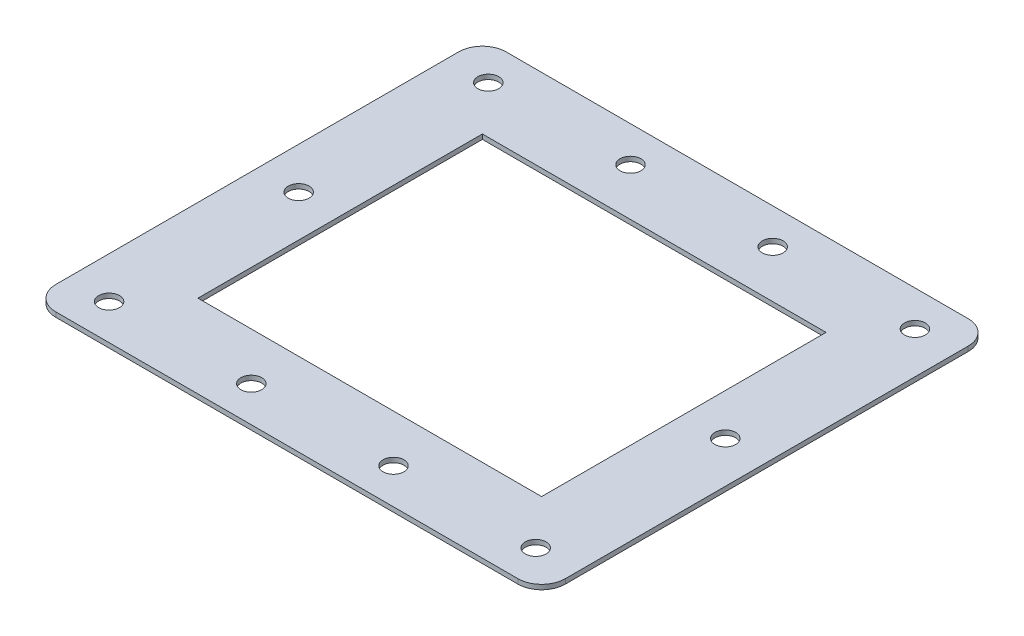
ISO-10303-21;
HEADER;
FILE_DESCRIPTION(('STEP AP214'),'2;1');
FILE_NAME('part.step','',(''),(''),'','','');
FILE_SCHEMA(('AUTOMOTIVE_DESIGN { 1 0 10303 214 1 1 1 1 }'));
ENDSEC;
DATA;
#1=APPLICATION_CONTEXT('core data for automotive mechanical design processes');
#2=APPLICATION_PROTOCOL_DEFINITION('international standard','automotive_design',2000,#1);
#3=PRODUCT_CONTEXT('',#1,'mechanical');
#4=PRODUCT('Part','Part','',(#3));
#5=PRODUCT_RELATED_PRODUCT_CATEGORY('part','',(#4));
#6=PRODUCT_DEFINITION_FORMATION('','',#4);
#7=PRODUCT_DEFINITION_CONTEXT('part definition',#1,'design');
#8=PRODUCT_DEFINITION('design','',#6,#7);
#9=PRODUCT_DEFINITION_SHAPE('','',#8);
#10=(LENGTH_UNIT() NAMED_UNIT(*) SI_UNIT(.MILLI.,.METRE.));
#11=(NAMED_UNIT(*) PLANE_ANGLE_UNIT() SI_UNIT($,.RADIAN.));
#12=(NAMED_UNIT(*) SI_UNIT($,.STERADIAN.) SOLID_ANGLE_UNIT());
#13=UNCERTAINTY_MEASURE_WITH_UNIT(LENGTH_MEASURE(1.E-05),#10,'distance_accuracy_value','');
#14=(GEOMETRIC_REPRESENTATION_CONTEXT(3) GLOBAL_UNCERTAINTY_ASSIGNED_CONTEXT((#13)) GLOBAL_UNIT_ASSIGNED_CONTEXT((#10,
#11,#12)) REPRESENTATION_CONTEXT('',''));
#15=CARTESIAN_POINT('',(0.,0.,0.));
#16=DIRECTION('',(0.,0.,1.));
#17=DIRECTION('',(1.,0.,0.));
#18=AXIS2_PLACEMENT_3D('',#15,#16,#17);
#19=CARTESIAN_POINT('',(0.,2.,0.));
#20=DIRECTION('',(0.,-1.,0.));
#21=DIRECTION('',(0.,0.,-1.));
#22=AXIS2_PLACEMENT_3D('',#19,#20,#21);
#23=PLANE('',#22);
#24=DIRECTION('',(-1.,0.,0.));
#25=VECTOR('',#24,1.);
#26=CARTESIAN_POINT('',(-107.5,2.,-95.));
#27=LINE('',#26,#25);
#28=CARTESIAN_POINT('',(97.5,2.,-95.));
#29=VERTEX_POINT('',#28);
#30=CARTESIAN_POINT('',(-97.5,2.,-95.));
#31=VERTEX_POINT('',#30);
#32=EDGE_CURVE('E173',#29,#31,#27,.T.);
#33=ORIENTED_EDGE('',*,*,#32,.T.);
#34=CARTESIAN_POINT('',(-97.5,2.,-85.));
#35=DIRECTION('',(0.,-1.,0.));
#36=DIRECTION('',(0.,0.,-1.));
#37=AXIS2_PLACEMENT_3D('',#34,#35,#36);
#38=CIRCLE('',#37,10.);
#39=CARTESIAN_POINT('',(-107.5,2.,-85.));
#40=VERTEX_POINT('',#39);
#41=EDGE_CURVE('E216',#31,#40,#38,.F.);
#42=ORIENTED_EDGE('',*,*,#41,.T.);
#43=DIRECTION('',(0.,0.,1.));
#44=VECTOR('',#43,1.);
#45=CARTESIAN_POINT('',(-107.5,2.,-95.));
#46=LINE('',#45,#44);
#47=CARTESIAN_POINT('',(-107.5,2.,85.));
#48=VERTEX_POINT('',#47);
#49=EDGE_CURVE('E176',#40,#48,#46,.T.);
#50=ORIENTED_EDGE('',*,*,#49,.T.);
#51=CARTESIAN_POINT('',(-97.5,2.,85.));
#52=DIRECTION('',(0.,-1.,0.));
#53=DIRECTION('',(0.,0.,-1.));
#54=AXIS2_PLACEMENT_3D('',#51,#52,#53);
#55=CIRCLE('',#54,10.);
#56=CARTESIAN_POINT('',(-97.5,2.,95.));
#57=VERTEX_POINT('',#56);
#58=EDGE_CURVE('E212',#48,#57,#55,.F.);
#59=ORIENTED_EDGE('',*,*,#58,.T.);
#60=DIRECTION('',(1.,0.,0.));
#61=VECTOR('',#60,1.);
#62=CARTESIAN_POINT('',(-107.5,2.,95.));
#63=LINE('',#62,#61);
#64=CARTESIAN_POINT('',(97.5,2.,95.));
#65=VERTEX_POINT('',#64);
#66=EDGE_CURVE('E180',#57,#65,#63,.T.);
#67=ORIENTED_EDGE('',*,*,#66,.T.);
#68=CARTESIAN_POINT('',(97.5,2.,85.));
#69=DIRECTION('',(0.,-1.,0.));
#70=DIRECTION('',(0.,0.,-1.));
#71=AXIS2_PLACEMENT_3D('',#68,#69,#70);
#72=CIRCLE('',#71,10.);
#73=CARTESIAN_POINT('',(107.5,2.,85.));
#74=VERTEX_POINT('',#73);
#75=EDGE_CURVE('E59',#65,#74,#72,.F.);
#76=ORIENTED_EDGE('',*,*,#75,.T.);
#77=DIRECTION('',(0.,0.,-1.));
#78=VECTOR('',#77,1.);
#79=CARTESIAN_POINT('',(107.5,2.,-95.));
#80=LINE('',#79,#78);
#81=CARTESIAN_POINT('',(107.5,2.,-85.));
#82=VERTEX_POINT('',#81);
#83=EDGE_CURVE('E182',#74,#82,#80,.T.);
#84=ORIENTED_EDGE('',*,*,#83,.T.);
#85=CARTESIAN_POINT('',(97.5,2.,-85.));
#86=DIRECTION('',(0.,-1.,0.));
#87=DIRECTION('',(0.,0.,-1.));
#88=AXIS2_PLACEMENT_3D('',#85,#86,#87);
#89=CIRCLE('',#88,10.);
#90=EDGE_CURVE('E214',#82,#29,#89,.F.);
#91=ORIENTED_EDGE('',*,*,#90,.T.);
#92=EDGE_LOOP('',(#33,#42,#50,#59,#67,#76,#84,#91));
#93=FACE_BOUND('',#92,.T.);
#94=DIRECTION('',(0.,0.,1.));
#95=VECTOR('',#94,1.);
#96=CARTESIAN_POINT('',(-72.5,2.,-60.));
#97=LINE('',#96,#95);
#98=CARTESIAN_POINT('',(-72.5,2.,-60.));
#99=VERTEX_POINT('',#98);
#100=CARTESIAN_POINT('',(-72.5,2.,60.));
#101=VERTEX_POINT('',#100);
#102=EDGE_CURVE('E129',#99,#101,#97,.T.);
#103=ORIENTED_EDGE('',*,*,#102,.F.);
#104=DIRECTION('',(-1.,0.,0.));
#105=VECTOR('',#104,1.);
#106=CARTESIAN_POINT('',(-72.5,2.,-60.));
#107=LINE('',#106,#105);
#108=CARTESIAN_POINT('',(72.5,2.,-60.));
#109=VERTEX_POINT('',#108);
#110=EDGE_CURVE('E155',#109,#99,#107,.T.);
#111=ORIENTED_EDGE('',*,*,#110,.F.);
#112=DIRECTION('',(0.,0.,-1.));
#113=VECTOR('',#112,1.);
#114=CARTESIAN_POINT('',(72.5,2.,-60.));
#115=LINE('',#114,#113);
#116=CARTESIAN_POINT('',(72.5,2.,60.));
#117=VERTEX_POINT('',#116);
#118=EDGE_CURVE('E153',#117,#109,#115,.T.);
#119=ORIENTED_EDGE('',*,*,#118,.F.);
#120=DIRECTION('',(1.,0.,0.));
#121=VECTOR('',#120,1.);
#122=CARTESIAN_POINT('',(-72.5,2.,60.));
#123=LINE('',#122,#121);
#124=EDGE_CURVE('E139',#101,#117,#123,.T.);
#125=ORIENTED_EDGE('',*,*,#124,.F.);
#126=EDGE_LOOP('',(#103,#111,#119,#125));
#127=FACE_BOUND('',#126,.T.);
#128=CARTESIAN_POINT('',(-90.,2.,-80.));
#129=DIRECTION('',(0.,1.,0.));
#130=DIRECTION('',(0.,0.,1.));
#131=AXIS2_PLACEMENT_3D('',#128,#129,#130);
#132=CIRCLE('',#131,4.4);
#133=CARTESIAN_POINT('',(-90.,2.,-75.6));
#134=VERTEX_POINT('',#133);
#135=EDGE_CURVE('E162',#134,#134,#132,.T.);
#136=ORIENTED_EDGE('',*,*,#135,.F.);
#137=EDGE_LOOP('',(#136));
#138=FACE_BOUND('',#137,.T.);
#139=CARTESIAN_POINT('',(-89.9999999999991,2.,0.));
#140=DIRECTION('',(0.,1.,0.));
#141=DIRECTION('',(0.,0.,1.));
#142=AXIS2_PLACEMENT_3D('',#139,#140,#141);
#143=CIRCLE('',#142,4.4);
#144=CARTESIAN_POINT('',(-89.9999999999991,2.,4.4));
#145=VERTEX_POINT('',#144);
#146=EDGE_CURVE('E534',#145,#145,#143,.T.);
#147=ORIENTED_EDGE('',*,*,#146,.F.);
#148=EDGE_LOOP('',(#147));
#149=FACE_BOUND('',#148,.T.);
#150=CARTESIAN_POINT('',(-30.,2.,-80.));
#151=DIRECTION('',(0.,1.,0.));
#152=DIRECTION('',(0.,0.,1.));
#153=AXIS2_PLACEMENT_3D('',#150,#151,#152);
#154=CIRCLE('',#153,4.4);
#155=CARTESIAN_POINT('',(-30.,2.,-75.6));
#156=VERTEX_POINT('',#155);
#157=EDGE_CURVE('E529',#156,#156,#154,.T.);
#158=ORIENTED_EDGE('',*,*,#157,.F.);
#159=EDGE_LOOP('',(#158));
#160=FACE_BOUND('',#159,.T.);
#161=CARTESIAN_POINT('',(-30.,2.,80.));
#162=DIRECTION('',(0.,1.,0.));
#163=DIRECTION('',(0.,0.,-1.));
#164=AXIS2_PLACEMENT_3D('',#161,#162,#163);
#165=CIRCLE('',#164,4.4);
#166=CARTESIAN_POINT('',(-30.,2.,75.6));
#167=VERTEX_POINT('',#166);
#168=EDGE_CURVE('E524',#167,#167,#165,.T.);
#169=ORIENTED_EDGE('',*,*,#168,.F.);
#170=EDGE_LOOP('',(#169));
#171=FACE_BOUND('',#170,.T.);
#172=CARTESIAN_POINT('',(30.,2.,-80.));
#173=DIRECTION('',(0.,1.,0.));
#174=DIRECTION('',(0.,0.,1.));
#175=AXIS2_PLACEMENT_3D('',#172,#173,#174);
#176=CIRCLE('',#175,4.4);
#177=CARTESIAN_POINT('',(30.,2.,-75.6));
#178=VERTEX_POINT('',#177);
#179=EDGE_CURVE('E519',#178,#178,#176,.T.);
#180=ORIENTED_EDGE('',*,*,#179,.F.);
#181=EDGE_LOOP('',(#180));
#182=FACE_BOUND('',#181,.T.);
#183=CARTESIAN_POINT('',(30.,2.,80.));
#184=DIRECTION('',(0.,1.,0.));
#185=DIRECTION('',(0.,0.,-1.));
#186=AXIS2_PLACEMENT_3D('',#183,#184,#185);
#187=CIRCLE('',#186,4.4);
#188=CARTESIAN_POINT('',(30.,2.,75.6));
#189=VERTEX_POINT('',#188);
#190=EDGE_CURVE('E514',#189,#189,#187,.T.);
#191=ORIENTED_EDGE('',*,*,#190,.F.);
#192=EDGE_LOOP('',(#191));
#193=FACE_BOUND('',#192,.T.);
#194=CARTESIAN_POINT('',(90.,2.,-80.));
#195=DIRECTION('',(0.,1.,0.));
#196=DIRECTION('',(0.,0.,1.));
#197=AXIS2_PLACEMENT_3D('',#194,#195,#196);
#198=CIRCLE('',#197,4.4);
#199=CARTESIAN_POINT('',(90.,2.,-75.6));
#200=VERTEX_POINT('',#199);
#201=EDGE_CURVE('E509',#200,#200,#198,.T.);
#202=ORIENTED_EDGE('',*,*,#201,.F.);
#203=EDGE_LOOP('',(#202));
#204=FACE_BOUND('',#203,.T.);
#205=CARTESIAN_POINT('',(90.0000000000009,2.,0.));
#206=DIRECTION('',(0.,1.,0.));
#207=DIRECTION('',(0.,0.,1.));
#208=AXIS2_PLACEMENT_3D('',#205,#206,#207);
#209=CIRCLE('',#208,4.4);
#210=CARTESIAN_POINT('',(90.0000000000009,2.,4.4));
#211=VERTEX_POINT('',#210);
#212=EDGE_CURVE('E504',#211,#211,#209,.T.);
#213=ORIENTED_EDGE('',*,*,#212,.F.);
#214=EDGE_LOOP('',(#213));
#215=FACE_BOUND('',#214,.T.);
#216=CARTESIAN_POINT('',(-90.,2.,80.));
#217=DIRECTION('',(0.,1.,0.));
#218=DIRECTION('',(0.,0.,-1.));
#219=AXIS2_PLACEMENT_3D('',#216,#217,#218);
#220=CIRCLE('',#219,4.4);
#221=CARTESIAN_POINT('',(-90.,2.,75.6));
#222=VERTEX_POINT('',#221);
#223=EDGE_CURVE('E499',#222,#222,#220,.T.);
#224=ORIENTED_EDGE('',*,*,#223,.F.);
#225=EDGE_LOOP('',(#224));
#226=FACE_BOUND('',#225,.T.);
#227=CARTESIAN_POINT('',(90.,2.,80.));
#228=DIRECTION('',(0.,1.,0.));
#229=DIRECTION('',(0.,0.,-1.));
#230=AXIS2_PLACEMENT_3D('',#227,#228,#229);
#231=CIRCLE('',#230,4.4);
#232=CARTESIAN_POINT('',(90.,2.,75.6));
#233=VERTEX_POINT('',#232);
#234=EDGE_CURVE('E494',#233,#233,#231,.T.);
#235=ORIENTED_EDGE('',*,*,#234,.F.);
#236=EDGE_LOOP('',(#235));
#237=FACE_BOUND('',#236,.T.);
#238=ADVANCED_FACE('F37',(#93,#127,#138,#149,#160,#171,#182,#193,#204,#215,#226,#237),#23,.F.);
#239=CARTESIAN_POINT('',(0.,0.,0.));
#240=DIRECTION('',(0.,-1.,0.));
#241=DIRECTION('',(0.,0.,-1.));
#242=AXIS2_PLACEMENT_3D('',#239,#240,#241);
#243=PLANE('',#242);
#244=CARTESIAN_POINT('',(-90.,0.,80.));
#245=DIRECTION('',(0.,1.,0.));
#246=DIRECTION('',(0.,0.,-1.));
#247=AXIS2_PLACEMENT_3D('',#244,#245,#246);
#248=CIRCLE('',#247,4.4);
#249=CARTESIAN_POINT('',(-90.,0.,75.6));
#250=VERTEX_POINT('',#249);
#251=EDGE_CURVE('E496',#250,#250,#248,.T.);
#252=ORIENTED_EDGE('',*,*,#251,.T.);
#253=EDGE_LOOP('',(#252));
#254=FACE_BOUND('',#253,.T.);
#255=CARTESIAN_POINT('',(90.,0.,-80.));
#256=DIRECTION('',(0.,1.,0.));
#257=DIRECTION('',(0.,0.,1.));
#258=AXIS2_PLACEMENT_3D('',#255,#256,#257);
#259=CIRCLE('',#258,4.4);
#260=CARTESIAN_POINT('',(90.,0.,-75.6));
#261=VERTEX_POINT('',#260);
#262=EDGE_CURVE('E507',#261,#261,#259,.T.);
#263=ORIENTED_EDGE('',*,*,#262,.T.);
#264=EDGE_LOOP('',(#263));
#265=FACE_BOUND('',#264,.T.);
#266=CARTESIAN_POINT('',(30.,0.,-80.));
#267=DIRECTION('',(0.,1.,0.));
#268=DIRECTION('',(0.,0.,1.));
#269=AXIS2_PLACEMENT_3D('',#266,#267,#268);
#270=CIRCLE('',#269,4.4);
#271=CARTESIAN_POINT('',(30.,0.,-75.6));
#272=VERTEX_POINT('',#271);
#273=EDGE_CURVE('E517',#272,#272,#270,.T.);
#274=ORIENTED_EDGE('',*,*,#273,.T.);
#275=EDGE_LOOP('',(#274));
#276=FACE_BOUND('',#275,.T.);
#277=CARTESIAN_POINT('',(-30.,0.,-80.));
#278=DIRECTION('',(0.,1.,0.));
#279=DIRECTION('',(0.,0.,1.));
#280=AXIS2_PLACEMENT_3D('',#277,#278,#279);
#281=CIRCLE('',#280,4.4);
#282=CARTESIAN_POINT('',(-30.,0.,-75.6));
#283=VERTEX_POINT('',#282);
#284=EDGE_CURVE('E527',#283,#283,#281,.T.);
#285=ORIENTED_EDGE('',*,*,#284,.T.);
#286=EDGE_LOOP('',(#285));
#287=FACE_BOUND('',#286,.T.);
#288=CARTESIAN_POINT('',(-90.,0.,-80.));
#289=DIRECTION('',(0.,1.,0.));
#290=DIRECTION('',(0.,0.,1.));
#291=AXIS2_PLACEMENT_3D('',#288,#289,#290);
#292=CIRCLE('',#291,4.4);
#293=CARTESIAN_POINT('',(-90.,0.,-75.6));
#294=VERTEX_POINT('',#293);
#295=EDGE_CURVE('E537',#294,#294,#292,.T.);
#296=ORIENTED_EDGE('',*,*,#295,.T.);
#297=EDGE_LOOP('',(#296));
#298=FACE_BOUND('',#297,.T.);
#299=DIRECTION('',(0.,0.,1.));
#300=VECTOR('',#299,1.);
#301=CARTESIAN_POINT('',(-107.5,0.,-95.));
#302=LINE('',#301,#300);
#303=CARTESIAN_POINT('',(-107.5,0.,-85.));
#304=VERTEX_POINT('',#303);
#305=CARTESIAN_POINT('',(-107.5,0.,85.));
#306=VERTEX_POINT('',#305);
#307=EDGE_CURVE('E187',#304,#306,#302,.T.);
#308=ORIENTED_EDGE('',*,*,#307,.F.);
#309=CARTESIAN_POINT('',(-97.5,0.,-85.));
#310=DIRECTION('',(0.,-1.,0.));
#311=DIRECTION('',(0.,0.,-1.));
#312=AXIS2_PLACEMENT_3D('',#309,#310,#311);
#313=CIRCLE('',#312,10.);
#314=CARTESIAN_POINT('',(-97.5,0.,-95.));
#315=VERTEX_POINT('',#314);
#316=EDGE_CURVE('E204',#304,#315,#313,.T.);
#317=ORIENTED_EDGE('',*,*,#316,.T.);
#318=DIRECTION('',(-1.,0.,0.));
#319=VECTOR('',#318,1.);
#320=CARTESIAN_POINT('',(-107.5,0.,-95.));
#321=LINE('',#320,#319);
#322=CARTESIAN_POINT('',(97.5,0.,-95.));
#323=VERTEX_POINT('',#322);
#324=EDGE_CURVE('E147',#323,#315,#321,.T.);
#325=ORIENTED_EDGE('',*,*,#324,.F.);
#326=CARTESIAN_POINT('',(97.5,0.,-85.));
#327=DIRECTION('',(0.,-1.,0.));
#328=DIRECTION('',(0.,0.,-1.));
#329=AXIS2_PLACEMENT_3D('',#326,#327,#328);
#330=CIRCLE('',#329,10.);
#331=CARTESIAN_POINT('',(107.5,0.,-85.));
#332=VERTEX_POINT('',#331);
#333=EDGE_CURVE('E202',#323,#332,#330,.T.);
#334=ORIENTED_EDGE('',*,*,#333,.T.);
#335=DIRECTION('',(0.,0.,-1.));
#336=VECTOR('',#335,1.);
#337=CARTESIAN_POINT('',(107.5,0.,-95.));
#338=LINE('',#337,#336);
#339=CARTESIAN_POINT('',(107.5,0.,85.));
#340=VERTEX_POINT('',#339);
#341=EDGE_CURVE('E177',#340,#332,#338,.T.);
#342=ORIENTED_EDGE('',*,*,#341,.F.);
#343=CARTESIAN_POINT('',(97.5,0.,85.));
#344=DIRECTION('',(0.,-1.,0.));
#345=DIRECTION('',(0.,0.,-1.));
#346=AXIS2_PLACEMENT_3D('',#343,#344,#345);
#347=CIRCLE('',#346,10.);
#348=CARTESIAN_POINT('',(97.5,0.,95.));
#349=VERTEX_POINT('',#348);
#350=EDGE_CURVE('E198',#340,#349,#347,.T.);
#351=ORIENTED_EDGE('',*,*,#350,.T.);
#352=DIRECTION('',(1.,0.,0.));
#353=VECTOR('',#352,1.);
#354=CARTESIAN_POINT('',(-107.5,0.,95.));
#355=LINE('',#354,#353);
#356=CARTESIAN_POINT('',(-97.5,0.,95.));
#357=VERTEX_POINT('',#356);
#358=EDGE_CURVE('E190',#357,#349,#355,.T.);
#359=ORIENTED_EDGE('',*,*,#358,.F.);
#360=CARTESIAN_POINT('',(-97.5,0.,85.));
#361=DIRECTION('',(0.,-1.,0.));
#362=DIRECTION('',(0.,0.,-1.));
#363=AXIS2_PLACEMENT_3D('',#360,#361,#362);
#364=CIRCLE('',#363,10.);
#365=EDGE_CURVE('E200',#357,#306,#364,.T.);
#366=ORIENTED_EDGE('',*,*,#365,.T.);
#367=EDGE_LOOP('',(#308,#317,#325,#334,#342,#351,#359,#366));
#368=FACE_BOUND('',#367,.T.);
#369=DIRECTION('',(-1.,0.,0.));
#370=VECTOR('',#369,1.);
#371=CARTESIAN_POINT('',(-72.5,0.,-60.));
#372=LINE('',#371,#370);
#373=CARTESIAN_POINT('',(72.5,0.,-60.));
#374=VERTEX_POINT('',#373);
#375=CARTESIAN_POINT('',(-72.5,0.,-60.));
#376=VERTEX_POINT('',#375);
#377=EDGE_CURVE('E140',#374,#376,#372,.T.);
#378=ORIENTED_EDGE('',*,*,#377,.T.);
#379=DIRECTION('',(0.,0.,1.));
#380=VECTOR('',#379,1.);
#381=CARTESIAN_POINT('',(-72.5,0.,-60.));
#382=LINE('',#381,#380);
#383=CARTESIAN_POINT('',(-72.5,0.,60.));
#384=VERTEX_POINT('',#383);
#385=EDGE_CURVE('E160',#376,#384,#382,.T.);
#386=ORIENTED_EDGE('',*,*,#385,.T.);
#387=DIRECTION('',(1.,0.,0.));
#388=VECTOR('',#387,1.);
#389=CARTESIAN_POINT('',(-72.5,0.,60.));
#390=LINE('',#389,#388);
#391=CARTESIAN_POINT('',(72.5,0.,60.));
#392=VERTEX_POINT('',#391);
#393=EDGE_CURVE('E146',#384,#392,#390,.T.);
#394=ORIENTED_EDGE('',*,*,#393,.T.);
#395=DIRECTION('',(0.,0.,-1.));
#396=VECTOR('',#395,1.);
#397=CARTESIAN_POINT('',(72.5,0.,-60.));
#398=LINE('',#397,#396);
#399=EDGE_CURVE('E164',#392,#374,#398,.T.);
#400=ORIENTED_EDGE('',*,*,#399,.T.);
#401=EDGE_LOOP('',(#378,#386,#394,#400));
#402=FACE_BOUND('',#401,.T.);
#403=CARTESIAN_POINT('',(-89.9999999999991,0.,0.));
#404=DIRECTION('',(0.,1.,0.));
#405=DIRECTION('',(0.,0.,1.));
#406=AXIS2_PLACEMENT_3D('',#403,#404,#405);
#407=CIRCLE('',#406,4.4);
#408=CARTESIAN_POINT('',(-89.9999999999991,0.,4.4));
#409=VERTEX_POINT('',#408);
#410=EDGE_CURVE('E478',#409,#409,#407,.T.);
#411=ORIENTED_EDGE('',*,*,#410,.T.);
#412=EDGE_LOOP('',(#411));
#413=FACE_BOUND('',#412,.T.);
#414=CARTESIAN_POINT('',(-30.,0.,80.));
#415=DIRECTION('',(0.,1.,0.));
#416=DIRECTION('',(0.,0.,-1.));
#417=AXIS2_PLACEMENT_3D('',#414,#415,#416);
#418=CIRCLE('',#417,4.4);
#419=CARTESIAN_POINT('',(-30.,0.,75.6));
#420=VERTEX_POINT('',#419);
#421=EDGE_CURVE('E482',#420,#420,#418,.T.);
#422=ORIENTED_EDGE('',*,*,#421,.T.);
#423=EDGE_LOOP('',(#422));
#424=FACE_BOUND('',#423,.T.);
#425=CARTESIAN_POINT('',(30.,0.,80.));
#426=DIRECTION('',(0.,1.,0.));
#427=DIRECTION('',(0.,0.,-1.));
#428=AXIS2_PLACEMENT_3D('',#425,#426,#427);
#429=CIRCLE('',#428,4.4);
#430=CARTESIAN_POINT('',(30.,0.,75.6));
#431=VERTEX_POINT('',#430);
#432=EDGE_CURVE('E486',#431,#431,#429,.T.);
#433=ORIENTED_EDGE('',*,*,#432,.T.);
#434=EDGE_LOOP('',(#433));
#435=FACE_BOUND('',#434,.T.);
#436=CARTESIAN_POINT('',(90.0000000000009,0.,0.));
#437=DIRECTION('',(0.,1.,0.));
#438=DIRECTION('',(0.,0.,1.));
#439=AXIS2_PLACEMENT_3D('',#436,#437,#438);
#440=CIRCLE('',#439,4.4);
#441=CARTESIAN_POINT('',(90.0000000000009,0.,4.4));
#442=VERTEX_POINT('',#441);
#443=EDGE_CURVE('E490',#442,#442,#440,.T.);
#444=ORIENTED_EDGE('',*,*,#443,.T.);
#445=EDGE_LOOP('',(#444));
#446=FACE_BOUND('',#445,.T.);
#447=CARTESIAN_POINT('',(90.,0.,80.));
#448=DIRECTION('',(0.,1.,0.));
#449=DIRECTION('',(0.,0.,-1.));
#450=AXIS2_PLACEMENT_3D('',#447,#448,#449);
#451=CIRCLE('',#450,4.4);
#452=CARTESIAN_POINT('',(90.,0.,75.6));
#453=VERTEX_POINT('',#452);
#454=EDGE_CURVE('E493',#453,#453,#451,.T.);
#455=ORIENTED_EDGE('',*,*,#454,.T.);
#456=EDGE_LOOP('',(#455));
#457=FACE_BOUND('',#456,.T.);
#458=ADVANCED_FACE('F234',(#254,#265,#276,#287,#298,#368,#402,#413,#424,#435,#446,#457),#243,.T.);
#459=CARTESIAN_POINT('',(-107.5,2.,-95.));
#460=DIRECTION('',(0.,0.,1.));
#461=DIRECTION('',(1.,0.,0.));
#462=AXIS2_PLACEMENT_3D('',#459,#460,#461);
#463=PLANE('',#462);
#464=ORIENTED_EDGE('',*,*,#324,.T.);
#465=DIRECTION('',(0.,-1.,0.));
#466=VECTOR('',#465,1.);
#467=CARTESIAN_POINT('',(-97.5,2.,-95.));
#468=LINE('',#467,#466);
#469=EDGE_CURVE('E209',#315,#31,#468,.F.);
#470=ORIENTED_EDGE('',*,*,#469,.T.);
#471=ORIENTED_EDGE('',*,*,#32,.F.);
#472=DIRECTION('',(0.,-1.,0.));
#473=VECTOR('',#472,1.);
#474=CARTESIAN_POINT('',(97.5,2.,-95.));
#475=LINE('',#474,#473);
#476=EDGE_CURVE('E206',#29,#323,#475,.T.);
#477=ORIENTED_EDGE('',*,*,#476,.T.);
#478=EDGE_LOOP('',(#464,#470,#471,#477));
#479=FACE_BOUND('',#478,.T.);
#480=ADVANCED_FACE('F243',(#479),#463,.F.);
#481=CARTESIAN_POINT('',(-107.5,2.,-95.));
#482=DIRECTION('',(1.,0.,0.));
#483=DIRECTION('',(0.,0.,-1.));
#484=AXIS2_PLACEMENT_3D('',#481,#482,#483);
#485=PLANE('',#484);
#486=ORIENTED_EDGE('',*,*,#49,.F.);
#487=DIRECTION('',(0.,-1.,0.));
#488=VECTOR('',#487,1.);
#489=CARTESIAN_POINT('',(-107.5,2.,-85.));
#490=LINE('',#489,#488);
#491=EDGE_CURVE('E195',#40,#304,#490,.T.);
#492=ORIENTED_EDGE('',*,*,#491,.T.);
#493=ORIENTED_EDGE('',*,*,#307,.T.);
#494=DIRECTION('',(0.,-1.,0.));
#495=VECTOR('',#494,1.);
#496=CARTESIAN_POINT('',(-107.5,2.,85.));
#497=LINE('',#496,#495);
#498=EDGE_CURVE('E184',#306,#48,#497,.F.);
#499=ORIENTED_EDGE('',*,*,#498,.T.);
#500=EDGE_LOOP('',(#486,#492,#493,#499));
#501=FACE_BOUND('',#500,.T.);
#502=ADVANCED_FACE('F251',(#501),#485,.F.);
#503=CARTESIAN_POINT('',(-107.5,2.,95.));
#504=DIRECTION('',(0.,0.,-1.));
#505=DIRECTION('',(-1.,0.,0.));
#506=AXIS2_PLACEMENT_3D('',#503,#504,#505);
#507=PLANE('',#506);
#508=ORIENTED_EDGE('',*,*,#66,.F.);
#509=DIRECTION('',(0.,-1.,0.));
#510=VECTOR('',#509,1.);
#511=CARTESIAN_POINT('',(-97.5,2.,95.));
#512=LINE('',#511,#510);
#513=EDGE_CURVE('E11',#57,#357,#512,.T.);
#514=ORIENTED_EDGE('',*,*,#513,.T.);
#515=ORIENTED_EDGE('',*,*,#358,.T.);
#516=DIRECTION('',(0.,-1.,0.));
#517=VECTOR('',#516,1.);
#518=CARTESIAN_POINT('',(97.5,2.,95.));
#519=LINE('',#518,#517);
#520=EDGE_CURVE('E45',#349,#65,#519,.F.);
#521=ORIENTED_EDGE('',*,*,#520,.T.);
#522=EDGE_LOOP('',(#508,#514,#515,#521));
#523=FACE_BOUND('',#522,.T.);
#524=ADVANCED_FACE('F224',(#523),#507,.F.);
#525=CARTESIAN_POINT('',(107.5,2.,-95.));
#526=DIRECTION('',(-1.,0.,0.));
#527=DIRECTION('',(0.,0.,1.));
#528=AXIS2_PLACEMENT_3D('',#525,#526,#527);
#529=PLANE('',#528);
#530=ORIENTED_EDGE('',*,*,#341,.T.);
#531=DIRECTION('',(0.,-1.,0.));
#532=VECTOR('',#531,1.);
#533=CARTESIAN_POINT('',(107.5,2.,-85.));
#534=LINE('',#533,#532);
#535=EDGE_CURVE('E52',#332,#82,#534,.F.);
#536=ORIENTED_EDGE('',*,*,#535,.T.);
#537=ORIENTED_EDGE('',*,*,#83,.F.);
#538=DIRECTION('',(0.,-1.,0.));
#539=VECTOR('',#538,1.);
#540=CARTESIAN_POINT('',(107.5,2.,85.));
#541=LINE('',#540,#539);
#542=EDGE_CURVE('E218',#74,#340,#541,.T.);
#543=ORIENTED_EDGE('',*,*,#542,.T.);
#544=EDGE_LOOP('',(#530,#536,#537,#543));
#545=FACE_BOUND('',#544,.T.);
#546=ADVANCED_FACE('F231',(#545),#529,.F.);
#547=CARTESIAN_POINT('',(-72.5,2.,-60.));
#548=DIRECTION('',(1.,0.,0.));
#549=DIRECTION('',(0.,0.,-1.));
#550=AXIS2_PLACEMENT_3D('',#547,#548,#549);
#551=PLANE('',#550);
#552=ORIENTED_EDGE('',*,*,#385,.F.);
#553=DIRECTION('',(0.,-1.,0.));
#554=VECTOR('',#553,1.);
#555=CARTESIAN_POINT('',(-72.5,2.,-60.));
#556=LINE('',#555,#554);
#557=EDGE_CURVE('E135',#99,#376,#556,.T.);
#558=ORIENTED_EDGE('',*,*,#557,.F.);
#559=ORIENTED_EDGE('',*,*,#102,.T.);
#560=DIRECTION('',(0.,-1.,0.));
#561=VECTOR('',#560,1.);
#562=CARTESIAN_POINT('',(-72.5,2.,60.));
#563=LINE('',#562,#561);
#564=EDGE_CURVE('E132',#101,#384,#563,.T.);
#565=ORIENTED_EDGE('',*,*,#564,.T.);
#566=EDGE_LOOP('',(#552,#558,#559,#565));
#567=FACE_BOUND('',#566,.T.);
#568=ADVANCED_FACE('F131',(#567),#551,.T.);
#569=CARTESIAN_POINT('',(-72.5,2.,60.));
#570=DIRECTION('',(0.,0.,-1.));
#571=DIRECTION('',(-1.,0.,0.));
#572=AXIS2_PLACEMENT_3D('',#569,#570,#571);
#573=PLANE('',#572);
#574=ORIENTED_EDGE('',*,*,#393,.F.);
#575=ORIENTED_EDGE('',*,*,#564,.F.);
#576=ORIENTED_EDGE('',*,*,#124,.T.);
#577=DIRECTION('',(0.,-1.,0.));
#578=VECTOR('',#577,1.);
#579=CARTESIAN_POINT('',(72.5,2.,60.));
#580=LINE('',#579,#578);
#581=EDGE_CURVE('E148',#117,#392,#580,.T.);
#582=ORIENTED_EDGE('',*,*,#581,.T.);
#583=EDGE_LOOP('',(#574,#575,#576,#582));
#584=FACE_BOUND('',#583,.T.);
#585=ADVANCED_FACE('F143',(#584),#573,.T.);
#586=CARTESIAN_POINT('',(72.5,2.,-60.));
#587=DIRECTION('',(-1.,0.,0.));
#588=DIRECTION('',(0.,0.,1.));
#589=AXIS2_PLACEMENT_3D('',#586,#587,#588);
#590=PLANE('',#589);
#591=ORIENTED_EDGE('',*,*,#399,.F.);
#592=ORIENTED_EDGE('',*,*,#581,.F.);
#593=ORIENTED_EDGE('',*,*,#118,.T.);
#594=DIRECTION('',(0.,-1.,0.));
#595=VECTOR('',#594,1.);
#596=CARTESIAN_POINT('',(72.5,2.,-60.));
#597=LINE('',#596,#595);
#598=EDGE_CURVE('E170',#109,#374,#597,.T.);
#599=ORIENTED_EDGE('',*,*,#598,.T.);
#600=EDGE_LOOP('',(#591,#592,#593,#599));
#601=FACE_BOUND('',#600,.T.);
#602=ADVANCED_FACE('F330',(#601),#590,.T.);
#603=CARTESIAN_POINT('',(-72.5,2.,-60.));
#604=DIRECTION('',(0.,0.,1.));
#605=DIRECTION('',(1.,0.,0.));
#606=AXIS2_PLACEMENT_3D('',#603,#604,#605);
#607=PLANE('',#606);
#608=ORIENTED_EDGE('',*,*,#377,.F.);
#609=ORIENTED_EDGE('',*,*,#598,.F.);
#610=ORIENTED_EDGE('',*,*,#110,.T.);
#611=ORIENTED_EDGE('',*,*,#557,.T.);
#612=EDGE_LOOP('',(#608,#609,#610,#611));
#613=FACE_BOUND('',#612,.T.);
#614=ADVANCED_FACE('F326',(#613),#607,.T.);
#615=CARTESIAN_POINT('',(-90.,2.,-80.));
#616=DIRECTION('',(0.,-1.,0.));
#617=DIRECTION('',(0.,0.,-1.));
#618=AXIS2_PLACEMENT_3D('',#615,#616,#617);
#619=CYLINDRICAL_SURFACE('',#618,4.4);
#620=ORIENTED_EDGE('',*,*,#135,.T.);
#621=EDGE_LOOP('',(#620));
#622=FACE_BOUND('',#621,.T.);
#623=ORIENTED_EDGE('',*,*,#295,.F.);
#624=EDGE_LOOP('',(#623));
#625=FACE_BOUND('',#624,.T.);
#626=ADVANCED_FACE('F322',(#622,#625),#619,.F.);
#627=CARTESIAN_POINT('',(-89.9999999999991,2.,0.));
#628=DIRECTION('',(0.,-1.,0.));
#629=DIRECTION('',(0.,0.,-1.));
#630=AXIS2_PLACEMENT_3D('',#627,#628,#629);
#631=CYLINDRICAL_SURFACE('',#630,4.4);
#632=ORIENTED_EDGE('',*,*,#146,.T.);
#633=EDGE_LOOP('',(#632));
#634=FACE_BOUND('',#633,.T.);
#635=ORIENTED_EDGE('',*,*,#410,.F.);
#636=EDGE_LOOP('',(#635));
#637=FACE_BOUND('',#636,.T.);
#638=ADVANCED_FACE('F318',(#634,#637),#631,.F.);
#639=CARTESIAN_POINT('',(-30.,2.,-80.));
#640=DIRECTION('',(0.,-1.,0.));
#641=DIRECTION('',(0.,0.,-1.));
#642=AXIS2_PLACEMENT_3D('',#639,#640,#641);
#643=CYLINDRICAL_SURFACE('',#642,4.4);
#644=ORIENTED_EDGE('',*,*,#157,.T.);
#645=EDGE_LOOP('',(#644));
#646=FACE_BOUND('',#645,.T.);
#647=ORIENTED_EDGE('',*,*,#284,.F.);
#648=EDGE_LOOP('',(#647));
#649=FACE_BOUND('',#648,.T.);
#650=ADVANCED_FACE('F314',(#646,#649),#643,.F.);
#651=CARTESIAN_POINT('',(-30.,2.,80.));
#652=DIRECTION('',(0.,-1.,0.));
#653=DIRECTION('',(0.,0.,-1.));
#654=AXIS2_PLACEMENT_3D('',#651,#652,#653);
#655=CYLINDRICAL_SURFACE('',#654,4.4);
#656=ORIENTED_EDGE('',*,*,#168,.T.);
#657=EDGE_LOOP('',(#656));
#658=FACE_BOUND('',#657,.T.);
#659=ORIENTED_EDGE('',*,*,#421,.F.);
#660=EDGE_LOOP('',(#659));
#661=FACE_BOUND('',#660,.T.);
#662=ADVANCED_FACE('F310',(#658,#661),#655,.F.);
#663=CARTESIAN_POINT('',(30.,2.,-80.));
#664=DIRECTION('',(0.,-1.,0.));
#665=DIRECTION('',(0.,0.,-1.));
#666=AXIS2_PLACEMENT_3D('',#663,#664,#665);
#667=CYLINDRICAL_SURFACE('',#666,4.4);
#668=ORIENTED_EDGE('',*,*,#179,.T.);
#669=EDGE_LOOP('',(#668));
#670=FACE_BOUND('',#669,.T.);
#671=ORIENTED_EDGE('',*,*,#273,.F.);
#672=EDGE_LOOP('',(#671));
#673=FACE_BOUND('',#672,.T.);
#674=ADVANCED_FACE('F306',(#670,#673),#667,.F.);
#675=CARTESIAN_POINT('',(30.,2.,80.));
#676=DIRECTION('',(0.,-1.,0.));
#677=DIRECTION('',(0.,0.,-1.));
#678=AXIS2_PLACEMENT_3D('',#675,#676,#677);
#679=CYLINDRICAL_SURFACE('',#678,4.4);
#680=ORIENTED_EDGE('',*,*,#190,.T.);
#681=EDGE_LOOP('',(#680));
#682=FACE_BOUND('',#681,.T.);
#683=ORIENTED_EDGE('',*,*,#432,.F.);
#684=EDGE_LOOP('',(#683));
#685=FACE_BOUND('',#684,.T.);
#686=ADVANCED_FACE('F302',(#682,#685),#679,.F.);
#687=CARTESIAN_POINT('',(90.,2.,-80.));
#688=DIRECTION('',(0.,-1.,0.));
#689=DIRECTION('',(0.,0.,-1.));
#690=AXIS2_PLACEMENT_3D('',#687,#688,#689);
#691=CYLINDRICAL_SURFACE('',#690,4.4);
#692=ORIENTED_EDGE('',*,*,#201,.T.);
#693=EDGE_LOOP('',(#692));
#694=FACE_BOUND('',#693,.T.);
#695=ORIENTED_EDGE('',*,*,#262,.F.);
#696=EDGE_LOOP('',(#695));
#697=FACE_BOUND('',#696,.T.);
#698=ADVANCED_FACE('F298',(#694,#697),#691,.F.);
#699=CARTESIAN_POINT('',(90.0000000000009,2.,0.));
#700=DIRECTION('',(0.,-1.,0.));
#701=DIRECTION('',(0.,0.,-1.));
#702=AXIS2_PLACEMENT_3D('',#699,#700,#701);
#703=CYLINDRICAL_SURFACE('',#702,4.4);
#704=ORIENTED_EDGE('',*,*,#212,.T.);
#705=EDGE_LOOP('',(#704));
#706=FACE_BOUND('',#705,.T.);
#707=ORIENTED_EDGE('',*,*,#443,.F.);
#708=EDGE_LOOP('',(#707));
#709=FACE_BOUND('',#708,.T.);
#710=ADVANCED_FACE('F290',(#706,#709),#703,.F.);
#711=CARTESIAN_POINT('',(-90.,2.,80.));
#712=DIRECTION('',(0.,-1.,0.));
#713=DIRECTION('',(0.,0.,-1.));
#714=AXIS2_PLACEMENT_3D('',#711,#712,#713);
#715=CYLINDRICAL_SURFACE('',#714,4.4);
#716=ORIENTED_EDGE('',*,*,#223,.T.);
#717=EDGE_LOOP('',(#716));
#718=FACE_BOUND('',#717,.T.);
#719=ORIENTED_EDGE('',*,*,#251,.F.);
#720=EDGE_LOOP('',(#719));
#721=FACE_BOUND('',#720,.T.);
#722=ADVANCED_FACE('F284',(#718,#721),#715,.F.);
#723=CARTESIAN_POINT('',(90.,2.,80.));
#724=DIRECTION('',(0.,-1.,0.));
#725=DIRECTION('',(0.,0.,-1.));
#726=AXIS2_PLACEMENT_3D('',#723,#724,#725);
#727=CYLINDRICAL_SURFACE('',#726,4.4);
#728=ORIENTED_EDGE('',*,*,#234,.T.);
#729=EDGE_LOOP('',(#728));
#730=FACE_BOUND('',#729,.T.);
#731=ORIENTED_EDGE('',*,*,#454,.F.);
#732=EDGE_LOOP('',(#731));
#733=FACE_BOUND('',#732,.T.);
#734=ADVANCED_FACE('F280',(#730,#733),#727,.F.);
#735=CARTESIAN_POINT('',(-97.5,2.,-85.));
#736=DIRECTION('',(0.,-1.,0.));
#737=DIRECTION('',(0.,0.,-1.));
#738=AXIS2_PLACEMENT_3D('',#735,#736,#737);
#739=CYLINDRICAL_SURFACE('',#738,10.);
#740=ORIENTED_EDGE('',*,*,#41,.F.);
#741=ORIENTED_EDGE('',*,*,#469,.F.);
#742=ORIENTED_EDGE('',*,*,#316,.F.);
#743=ORIENTED_EDGE('',*,*,#491,.F.);
#744=EDGE_LOOP('',(#740,#741,#742,#743));
#745=FACE_BOUND('',#744,.T.);
#746=ADVANCED_FACE('F249',(#745),#739,.T.);
#747=CARTESIAN_POINT('',(97.5,2.,-85.));
#748=DIRECTION('',(0.,-1.,0.));
#749=DIRECTION('',(0.,0.,-1.));
#750=AXIS2_PLACEMENT_3D('',#747,#748,#749);
#751=CYLINDRICAL_SURFACE('',#750,10.);
#752=ORIENTED_EDGE('',*,*,#90,.F.);
#753=ORIENTED_EDGE('',*,*,#535,.F.);
#754=ORIENTED_EDGE('',*,*,#333,.F.);
#755=ORIENTED_EDGE('',*,*,#476,.F.);
#756=EDGE_LOOP('',(#752,#753,#754,#755));
#757=FACE_BOUND('',#756,.T.);
#758=ADVANCED_FACE('F240',(#757),#751,.T.);
#759=CARTESIAN_POINT('',(-97.5,2.,85.));
#760=DIRECTION('',(0.,-1.,0.));
#761=DIRECTION('',(0.,0.,-1.));
#762=AXIS2_PLACEMENT_3D('',#759,#760,#761);
#763=CYLINDRICAL_SURFACE('',#762,10.);
#764=ORIENTED_EDGE('',*,*,#58,.F.);
#765=ORIENTED_EDGE('',*,*,#498,.F.);
#766=ORIENTED_EDGE('',*,*,#365,.F.);
#767=ORIENTED_EDGE('',*,*,#513,.F.);
#768=EDGE_LOOP('',(#764,#765,#766,#767));
#769=FACE_BOUND('',#768,.T.);
#770=ADVANCED_FACE('F254',(#769),#763,.T.);
#771=CARTESIAN_POINT('',(97.5,2.,85.));
#772=DIRECTION('',(0.,-1.,0.));
#773=DIRECTION('',(0.,0.,-1.));
#774=AXIS2_PLACEMENT_3D('',#771,#772,#773);
#775=CYLINDRICAL_SURFACE('',#774,10.);
#776=ORIENTED_EDGE('',*,*,#75,.F.);
#777=ORIENTED_EDGE('',*,*,#520,.F.);
#778=ORIENTED_EDGE('',*,*,#350,.F.);
#779=ORIENTED_EDGE('',*,*,#542,.F.);
#780=EDGE_LOOP('',(#776,#777,#778,#779));
#781=FACE_BOUND('',#780,.T.);
#782=ADVANCED_FACE('F39',(#781),#775,.T.);
#783=CLOSED_SHELL('',(#238,#458,#480,#502,#524,#546,#568,#585,#602,#614,#626,#638,#650,#662,
#674,#686,#698,#710,#722,#734,#746,#758,#770,#782));
#784=MANIFOLD_SOLID_BREP('B2',#783);
#785=ADVANCED_BREP_SHAPE_REPRESENTATION('',(#18,#784),#14);
#786=SHAPE_DEFINITION_REPRESENTATION(#9,#785);
ENDSEC;
END-ISO-10303-21;
